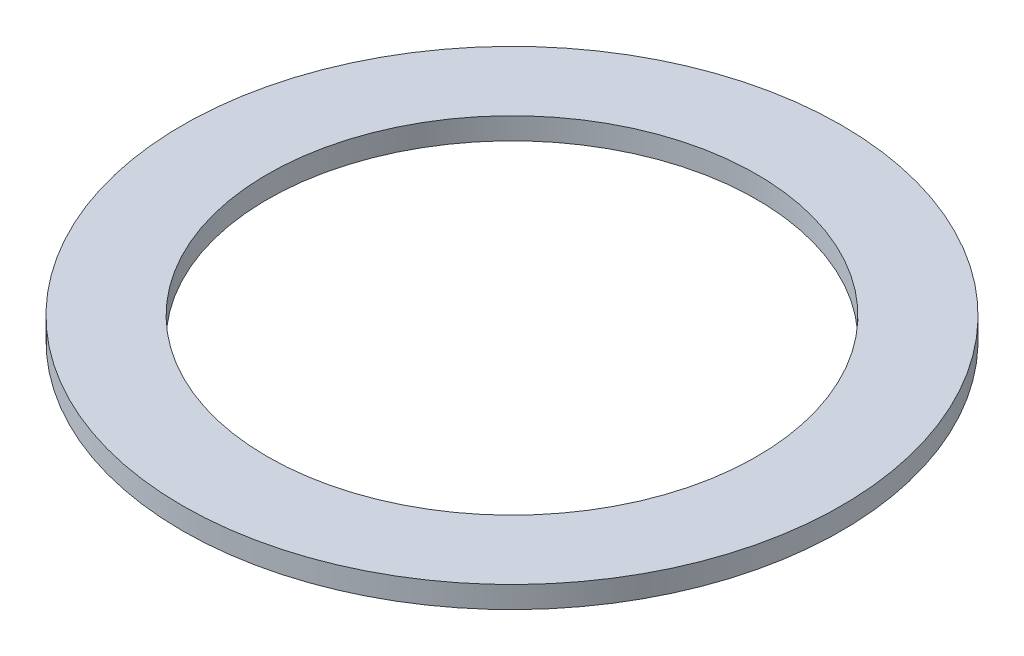
ISO-10303-21;
HEADER;
FILE_DESCRIPTION(('STEP AP214'),'2;1');
FILE_NAME('part.step','',(''),(''),'','','');
FILE_SCHEMA(('AUTOMOTIVE_DESIGN { 1 0 10303 214 1 1 1 1 }'));
ENDSEC;
DATA;
#1=APPLICATION_CONTEXT('core data for automotive mechanical design processes');
#2=APPLICATION_PROTOCOL_DEFINITION('international standard','automotive_design',2000,#1);
#3=PRODUCT_CONTEXT('',#1,'mechanical');
#4=PRODUCT('Part','Part','',(#3));
#5=PRODUCT_RELATED_PRODUCT_CATEGORY('part','',(#4));
#6=PRODUCT_DEFINITION_FORMATION('','',#4);
#7=PRODUCT_DEFINITION_CONTEXT('part definition',#1,'design');
#8=PRODUCT_DEFINITION('design','',#6,#7);
#9=PRODUCT_DEFINITION_SHAPE('','',#8);
#10=(LENGTH_UNIT() NAMED_UNIT(*) SI_UNIT(.MILLI.,.METRE.));
#11=(NAMED_UNIT(*) PLANE_ANGLE_UNIT() SI_UNIT($,.RADIAN.));
#12=(NAMED_UNIT(*) SI_UNIT($,.STERADIAN.) SOLID_ANGLE_UNIT());
#13=UNCERTAINTY_MEASURE_WITH_UNIT(LENGTH_MEASURE(1.E-05),#10,'distance_accuracy_value','');
#14=(GEOMETRIC_REPRESENTATION_CONTEXT(3) GLOBAL_UNCERTAINTY_ASSIGNED_CONTEXT((#13)) GLOBAL_UNIT_ASSIGNED_CONTEXT((#10,
#11,#12)) REPRESENTATION_CONTEXT('',''));
#15=CARTESIAN_POINT('',(0.,0.,0.));
#16=DIRECTION('',(0.,0.,1.));
#17=DIRECTION('',(1.,0.,0.));
#18=AXIS2_PLACEMENT_3D('',#15,#16,#17);
#19=CARTESIAN_POINT('',(0.,4.,0.));
#20=DIRECTION('',(0.,1.,0.));
#21=DIRECTION('',(0.,0.,1.));
#22=AXIS2_PLACEMENT_3D('',#19,#20,#21);
#23=PLANE('',#22);
#24=CARTESIAN_POINT('',(0.,4.,0.));
#25=DIRECTION('',(0.,1.,0.));
#26=DIRECTION('',(0.,0.,1.));
#27=AXIS2_PLACEMENT_3D('',#24,#25,#26);
#28=CIRCLE('',#27,60.625);
#29=CARTESIAN_POINT('',(0.,4.,60.625));
#30=VERTEX_POINT('',#29);
#31=EDGE_CURVE('E10',#30,#30,#28,.T.);
#32=ORIENTED_EDGE('',*,*,#31,.T.);
#33=EDGE_LOOP('',(#32));
#34=FACE_BOUND('',#33,.T.);
#35=CARTESIAN_POINT('',(0.,4.,0.));
#36=DIRECTION('',(0.,1.,0.));
#37=DIRECTION('',(0.,0.,1.));
#38=AXIS2_PLACEMENT_3D('',#35,#36,#37);
#39=CIRCLE('',#38,45.);
#40=CARTESIAN_POINT('',(0.,4.,45.));
#41=VERTEX_POINT('',#40);
#42=EDGE_CURVE('E44',#41,#41,#39,.T.);
#43=ORIENTED_EDGE('',*,*,#42,.F.);
#44=EDGE_LOOP('',(#43));
#45=FACE_BOUND('',#44,.T.);
#46=ADVANCED_FACE('F33',(#34,#45),#23,.T.);
#47=CARTESIAN_POINT('',(0.,0.,0.));
#48=DIRECTION('',(0.,1.,0.));
#49=DIRECTION('',(0.,0.,1.));
#50=AXIS2_PLACEMENT_3D('',#47,#48,#49);
#51=PLANE('',#50);
#52=CARTESIAN_POINT('',(0.,0.,0.));
#53=DIRECTION('',(0.,1.,0.));
#54=DIRECTION('',(0.,0.,1.));
#55=AXIS2_PLACEMENT_3D('',#52,#53,#54);
#56=CIRCLE('',#55,60.625);
#57=CARTESIAN_POINT('',(0.,0.,60.625));
#58=VERTEX_POINT('',#57);
#59=EDGE_CURVE('E37',#58,#58,#56,.T.);
#60=ORIENTED_EDGE('',*,*,#59,.F.);
#61=EDGE_LOOP('',(#60));
#62=FACE_BOUND('',#61,.T.);
#63=CARTESIAN_POINT('',(0.,0.,0.));
#64=DIRECTION('',(0.,1.,0.));
#65=DIRECTION('',(0.,0.,1.));
#66=AXIS2_PLACEMENT_3D('',#63,#64,#65);
#67=CIRCLE('',#66,45.);
#68=CARTESIAN_POINT('',(0.,0.,45.));
#69=VERTEX_POINT('',#68);
#70=EDGE_CURVE('E46',#69,#69,#67,.T.);
#71=ORIENTED_EDGE('',*,*,#70,.T.);
#72=EDGE_LOOP('',(#71));
#73=FACE_BOUND('',#72,.T.);
#74=ADVANCED_FACE('F56',(#62,#73),#51,.F.);
#75=CARTESIAN_POINT('',(0.,4.,0.));
#76=DIRECTION('',(0.,-1.,0.));
#77=DIRECTION('',(0.,0.,-1.));
#78=AXIS2_PLACEMENT_3D('',#75,#76,#77);
#79=CYLINDRICAL_SURFACE('',#78,60.625);
#80=ORIENTED_EDGE('',*,*,#31,.F.);
#81=EDGE_LOOP('',(#80));
#82=FACE_BOUND('',#81,.T.);
#83=ORIENTED_EDGE('',*,*,#59,.T.);
#84=EDGE_LOOP('',(#83));
#85=FACE_BOUND('',#84,.T.);
#86=ADVANCED_FACE('F35',(#82,#85),#79,.T.);
#87=CARTESIAN_POINT('',(0.,4.,0.));
#88=DIRECTION('',(0.,-1.,0.));
#89=DIRECTION('',(0.,0.,-1.));
#90=AXIS2_PLACEMENT_3D('',#87,#88,#89);
#91=CYLINDRICAL_SURFACE('',#90,45.);
#92=ORIENTED_EDGE('',*,*,#42,.T.);
#93=EDGE_LOOP('',(#92));
#94=FACE_BOUND('',#93,.T.);
#95=ORIENTED_EDGE('',*,*,#70,.F.);
#96=EDGE_LOOP('',(#95));
#97=FACE_BOUND('',#96,.T.);
#98=ADVANCED_FACE('F52',(#94,#97),#91,.F.);
#99=CLOSED_SHELL('',(#46,#74,#86,#98));
#100=MANIFOLD_SOLID_BREP('B2',#99);
#101=ADVANCED_BREP_SHAPE_REPRESENTATION('',(#18,#100),#14);
#102=SHAPE_DEFINITION_REPRESENTATION(#9,#101);
ENDSEC;
END-ISO-10303-21;
